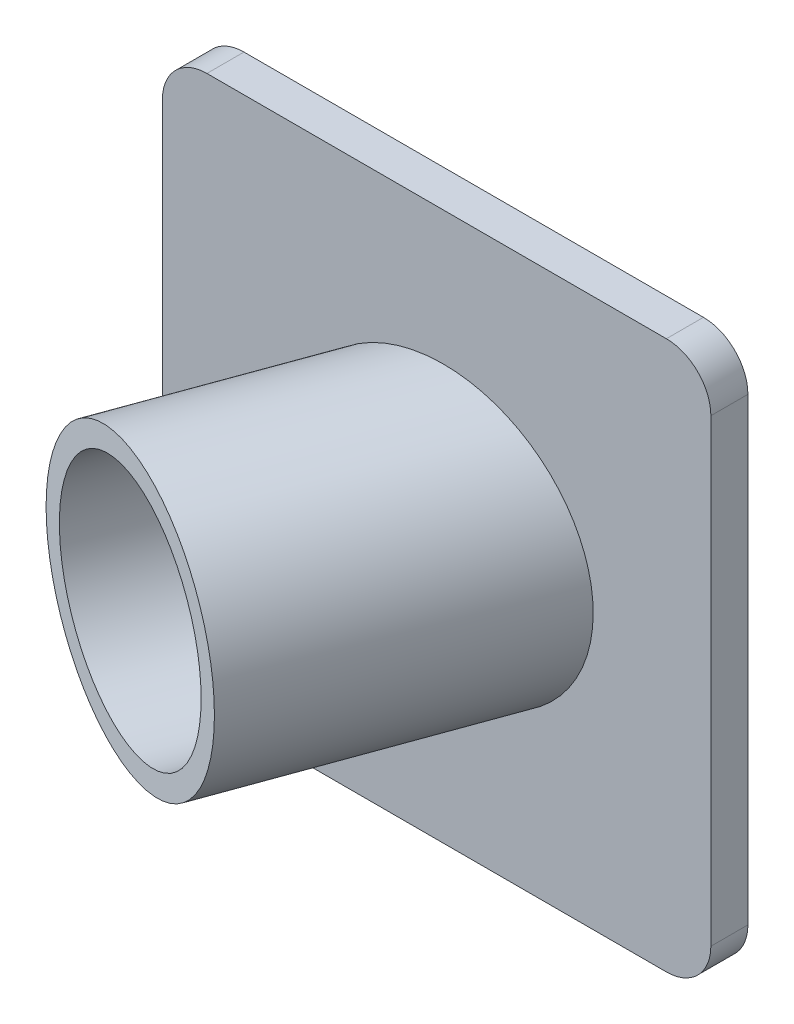
ISO-10303-21;
HEADER;
FILE_DESCRIPTION(('STEP AP214'),'2;1');
FILE_NAME('part.step','',(''),(''),'','','');
FILE_SCHEMA(('AUTOMOTIVE_DESIGN { 1 0 10303 214 1 1 1 1 }'));
ENDSEC;
DATA;
#1=APPLICATION_CONTEXT('core data for automotive mechanical design processes');
#2=APPLICATION_PROTOCOL_DEFINITION('international standard','automotive_design',2000,#1);
#3=PRODUCT_CONTEXT('',#1,'mechanical');
#4=PRODUCT('Part','Part','',(#3));
#5=PRODUCT_RELATED_PRODUCT_CATEGORY('part','',(#4));
#6=PRODUCT_DEFINITION_FORMATION('','',#4);
#7=PRODUCT_DEFINITION_CONTEXT('part definition',#1,'design');
#8=PRODUCT_DEFINITION('design','',#6,#7);
#9=PRODUCT_DEFINITION_SHAPE('','',#8);
#10=(LENGTH_UNIT() NAMED_UNIT(*) SI_UNIT(.MILLI.,.METRE.));
#11=(NAMED_UNIT(*) PLANE_ANGLE_UNIT() SI_UNIT($,.RADIAN.));
#12=(NAMED_UNIT(*) SI_UNIT($,.STERADIAN.) SOLID_ANGLE_UNIT());
#13=UNCERTAINTY_MEASURE_WITH_UNIT(LENGTH_MEASURE(1.E-05),#10,'distance_accuracy_value','');
#14=(GEOMETRIC_REPRESENTATION_CONTEXT(3) GLOBAL_UNCERTAINTY_ASSIGNED_CONTEXT((#13)) GLOBAL_UNIT_ASSIGNED_CONTEXT((#10,
#11,#12)) REPRESENTATION_CONTEXT('',''));
#15=CARTESIAN_POINT('',(0.,0.,0.));
#16=DIRECTION('',(0.,0.,1.));
#17=DIRECTION('',(1.,0.,0.));
#18=AXIS2_PLACEMENT_3D('',#15,#16,#17);
#19=CARTESIAN_POINT('',(-15.5,15.5,2.5));
#20=DIRECTION('',(0.,0.,-1.));
#21=DIRECTION('',(-1.,0.,0.));
#22=AXIS2_PLACEMENT_3D('',#19,#20,#21);
#23=CYLINDRICAL_SURFACE('',#22,3.);
#24=CARTESIAN_POINT('',(-15.5,15.5,0.));
#25=DIRECTION('',(0.,0.,1.));
#26=DIRECTION('',(-1.,0.,0.));
#27=AXIS2_PLACEMENT_3D('',#24,#25,#26);
#28=CIRCLE('',#27,3.);
#29=CARTESIAN_POINT('',(-15.5,18.5,0.));
#30=VERTEX_POINT('',#29);
#31=CARTESIAN_POINT('',(-18.5,15.5,0.));
#32=VERTEX_POINT('',#31);
#33=EDGE_CURVE('E135',#30,#32,#28,.T.);
#34=ORIENTED_EDGE('',*,*,#33,.T.);
#35=DIRECTION('',(0.,0.,-1.));
#36=VECTOR('',#35,1.);
#37=CARTESIAN_POINT('',(-18.5,15.5,2.5));
#38=LINE('',#37,#36);
#39=CARTESIAN_POINT('',(-18.5,15.5,2.5));
#40=VERTEX_POINT('',#39);
#41=EDGE_CURVE('E40',#40,#32,#38,.T.);
#42=ORIENTED_EDGE('',*,*,#41,.F.);
#43=CARTESIAN_POINT('',(-15.5,15.5,2.5));
#44=DIRECTION('',(0.,0.,1.));
#45=DIRECTION('',(-1.,0.,0.));
#46=AXIS2_PLACEMENT_3D('',#43,#44,#45);
#47=CIRCLE('',#46,3.);
#48=CARTESIAN_POINT('',(-15.5,18.5,2.5));
#49=VERTEX_POINT('',#48);
#50=EDGE_CURVE('E150',#49,#40,#47,.T.);
#51=ORIENTED_EDGE('',*,*,#50,.F.);
#52=DIRECTION('',(0.,0.,-1.));
#53=VECTOR('',#52,1.);
#54=CARTESIAN_POINT('',(-15.5,18.5,2.5));
#55=LINE('',#54,#53);
#56=EDGE_CURVE('E131',#49,#30,#55,.T.);
#57=ORIENTED_EDGE('',*,*,#56,.T.);
#58=EDGE_LOOP('',(#34,#42,#51,#57));
#59=FACE_BOUND('',#58,.T.);
#60=ADVANCED_FACE('F37',(#59),#23,.T.);
#61=CARTESIAN_POINT('',(-18.5,-15.5,2.5));
#62=DIRECTION('',(1.,0.,0.));
#63=DIRECTION('',(0.,1.,0.));
#64=AXIS2_PLACEMENT_3D('',#61,#62,#63);
#65=PLANE('',#64);
#66=DIRECTION('',(0.,-1.,0.));
#67=VECTOR('',#66,1.);
#68=CARTESIAN_POINT('',(-18.5,-15.5,0.));
#69=LINE('',#68,#67);
#70=CARTESIAN_POINT('',(-18.5,-15.5,0.));
#71=VERTEX_POINT('',#70);
#72=EDGE_CURVE('E138',#32,#71,#69,.T.);
#73=ORIENTED_EDGE('',*,*,#72,.T.);
#74=DIRECTION('',(0.,0.,-1.));
#75=VECTOR('',#74,1.);
#76=CARTESIAN_POINT('',(-18.5,-15.5,2.5));
#77=LINE('',#76,#75);
#78=CARTESIAN_POINT('',(-18.5,-15.5,2.5));
#79=VERTEX_POINT('',#78);
#80=EDGE_CURVE('E159',#79,#71,#77,.T.);
#81=ORIENTED_EDGE('',*,*,#80,.F.);
#82=DIRECTION('',(0.,-1.,0.));
#83=VECTOR('',#82,1.);
#84=CARTESIAN_POINT('',(-18.5,-15.5,2.5));
#85=LINE('',#84,#83);
#86=EDGE_CURVE('E98',#40,#79,#85,.T.);
#87=ORIENTED_EDGE('',*,*,#86,.F.);
#88=ORIENTED_EDGE('',*,*,#41,.T.);
#89=EDGE_LOOP('',(#73,#81,#87,#88));
#90=FACE_BOUND('',#89,.T.);
#91=ADVANCED_FACE('F165',(#90),#65,.F.);
#92=CARTESIAN_POINT('',(-15.5,-15.5,2.5));
#93=DIRECTION('',(0.,0.,-1.));
#94=DIRECTION('',(-1.,0.,0.));
#95=AXIS2_PLACEMENT_3D('',#92,#93,#94);
#96=CYLINDRICAL_SURFACE('',#95,3.);
#97=CARTESIAN_POINT('',(-15.5,-15.5,0.));
#98=DIRECTION('',(0.,0.,1.));
#99=DIRECTION('',(-1.,0.,0.));
#100=AXIS2_PLACEMENT_3D('',#97,#98,#99);
#101=CIRCLE('',#100,3.);
#102=CARTESIAN_POINT('',(-15.5,-18.5,0.));
#103=VERTEX_POINT('',#102);
#104=EDGE_CURVE('E141',#71,#103,#101,.T.);
#105=ORIENTED_EDGE('',*,*,#104,.T.);
#106=DIRECTION('',(0.,0.,-1.));
#107=VECTOR('',#106,1.);
#108=CARTESIAN_POINT('',(-15.5,-18.5,2.5));
#109=LINE('',#108,#107);
#110=CARTESIAN_POINT('',(-15.5,-18.5,2.5));
#111=VERTEX_POINT('',#110);
#112=EDGE_CURVE('E157',#111,#103,#109,.T.);
#113=ORIENTED_EDGE('',*,*,#112,.F.);
#114=CARTESIAN_POINT('',(-15.5,-15.5,2.5));
#115=DIRECTION('',(0.,0.,1.));
#116=DIRECTION('',(-1.,0.,0.));
#117=AXIS2_PLACEMENT_3D('',#114,#115,#116);
#118=CIRCLE('',#117,3.);
#119=EDGE_CURVE('E180',#79,#111,#118,.T.);
#120=ORIENTED_EDGE('',*,*,#119,.F.);
#121=ORIENTED_EDGE('',*,*,#80,.T.);
#122=EDGE_LOOP('',(#105,#113,#120,#121));
#123=FACE_BOUND('',#122,.T.);
#124=ADVANCED_FACE('F174',(#123),#96,.T.);
#125=CARTESIAN_POINT('',(-15.5,-18.5,2.5));
#126=DIRECTION('',(0.,1.,0.));
#127=DIRECTION('',(0.,0.,1.));
#128=AXIS2_PLACEMENT_3D('',#125,#126,#127);
#129=PLANE('',#128);
#130=DIRECTION('',(1.,0.,0.));
#131=VECTOR('',#130,1.);
#132=CARTESIAN_POINT('',(-15.5,-18.5,0.));
#133=LINE('',#132,#131);
#134=CARTESIAN_POINT('',(15.5,-18.5,0.));
#135=VERTEX_POINT('',#134);
#136=EDGE_CURVE('E143',#103,#135,#133,.T.);
#137=ORIENTED_EDGE('',*,*,#136,.T.);
#138=DIRECTION('',(0.,0.,-1.));
#139=VECTOR('',#138,1.);
#140=CARTESIAN_POINT('',(15.5,-18.5,2.5));
#141=LINE('',#140,#139);
#142=CARTESIAN_POINT('',(15.5,-18.5,2.5));
#143=VERTEX_POINT('',#142);
#144=EDGE_CURVE('E154',#143,#135,#141,.T.);
#145=ORIENTED_EDGE('',*,*,#144,.F.);
#146=DIRECTION('',(1.,0.,0.));
#147=VECTOR('',#146,1.);
#148=CARTESIAN_POINT('',(-15.5,-18.5,2.5));
#149=LINE('',#148,#147);
#150=EDGE_CURVE('E179',#111,#143,#149,.T.);
#151=ORIENTED_EDGE('',*,*,#150,.F.);
#152=ORIENTED_EDGE('',*,*,#112,.T.);
#153=EDGE_LOOP('',(#137,#145,#151,#152));
#154=FACE_BOUND('',#153,.T.);
#155=ADVANCED_FACE('F177',(#154),#129,.F.);
#156=CARTESIAN_POINT('',(15.5,-15.5,2.5));
#157=DIRECTION('',(0.,0.,-1.));
#158=DIRECTION('',(-1.,0.,0.));
#159=AXIS2_PLACEMENT_3D('',#156,#157,#158);
#160=CYLINDRICAL_SURFACE('',#159,3.);
#161=CARTESIAN_POINT('',(15.5,-15.5,0.));
#162=DIRECTION('',(0.,0.,1.));
#163=DIRECTION('',(1.,0.,0.));
#164=AXIS2_PLACEMENT_3D('',#161,#162,#163);
#165=CIRCLE('',#164,3.);
#166=CARTESIAN_POINT('',(18.5,-15.5,0.));
#167=VERTEX_POINT('',#166);
#168=EDGE_CURVE('E145',#135,#167,#165,.T.);
#169=ORIENTED_EDGE('',*,*,#168,.T.);
#170=DIRECTION('',(0.,0.,-1.));
#171=VECTOR('',#170,1.);
#172=CARTESIAN_POINT('',(18.5,-15.5,2.5));
#173=LINE('',#172,#171);
#174=CARTESIAN_POINT('',(18.5,-15.5,2.5));
#175=VERTEX_POINT('',#174);
#176=EDGE_CURVE('E126',#175,#167,#173,.T.);
#177=ORIENTED_EDGE('',*,*,#176,.F.);
#178=CARTESIAN_POINT('',(15.5,-15.5,2.5));
#179=DIRECTION('',(0.,0.,1.));
#180=DIRECTION('',(1.,0.,0.));
#181=AXIS2_PLACEMENT_3D('',#178,#179,#180);
#182=CIRCLE('',#181,3.);
#183=EDGE_CURVE('E117',#143,#175,#182,.T.);
#184=ORIENTED_EDGE('',*,*,#183,.F.);
#185=ORIENTED_EDGE('',*,*,#144,.T.);
#186=EDGE_LOOP('',(#169,#177,#184,#185));
#187=FACE_BOUND('',#186,.T.);
#188=ADVANCED_FACE('F225',(#187),#160,.T.);
#189=CARTESIAN_POINT('',(18.5,-15.5,2.5));
#190=DIRECTION('',(-1.,0.,0.));
#191=DIRECTION('',(0.,0.,1.));
#192=AXIS2_PLACEMENT_3D('',#189,#190,#191);
#193=PLANE('',#192);
#194=DIRECTION('',(0.,1.,0.));
#195=VECTOR('',#194,1.);
#196=CARTESIAN_POINT('',(18.5,-15.5,0.));
#197=LINE('',#196,#195);
#198=CARTESIAN_POINT('',(18.5,15.5,0.));
#199=VERTEX_POINT('',#198);
#200=EDGE_CURVE('E125',#167,#199,#197,.T.);
#201=ORIENTED_EDGE('',*,*,#200,.T.);
#202=DIRECTION('',(0.,0.,-1.));
#203=VECTOR('',#202,1.);
#204=CARTESIAN_POINT('',(18.5,15.5,2.5));
#205=LINE('',#204,#203);
#206=CARTESIAN_POINT('',(18.5,15.5,2.5));
#207=VERTEX_POINT('',#206);
#208=EDGE_CURVE('E122',#207,#199,#205,.T.);
#209=ORIENTED_EDGE('',*,*,#208,.F.);
#210=DIRECTION('',(0.,1.,0.));
#211=VECTOR('',#210,1.);
#212=CARTESIAN_POINT('',(18.5,-15.5,2.5));
#213=LINE('',#212,#211);
#214=EDGE_CURVE('E111',#175,#207,#213,.T.);
#215=ORIENTED_EDGE('',*,*,#214,.F.);
#216=ORIENTED_EDGE('',*,*,#176,.T.);
#217=EDGE_LOOP('',(#201,#209,#215,#216));
#218=FACE_BOUND('',#217,.T.);
#219=ADVANCED_FACE('F123',(#218),#193,.F.);
#220=CARTESIAN_POINT('',(15.5,15.5,2.5));
#221=DIRECTION('',(0.,0.,-1.));
#222=DIRECTION('',(-1.,0.,0.));
#223=AXIS2_PLACEMENT_3D('',#220,#221,#222);
#224=CYLINDRICAL_SURFACE('',#223,3.);
#225=CARTESIAN_POINT('',(15.5,15.5,0.));
#226=DIRECTION('',(0.,0.,1.));
#227=DIRECTION('',(1.,0.,0.));
#228=AXIS2_PLACEMENT_3D('',#225,#226,#227);
#229=CIRCLE('',#228,3.);
#230=CARTESIAN_POINT('',(15.5,18.5,0.));
#231=VERTEX_POINT('',#230);
#232=EDGE_CURVE('E83',#199,#231,#229,.T.);
#233=ORIENTED_EDGE('',*,*,#232,.T.);
#234=DIRECTION('',(0.,0.,-1.));
#235=VECTOR('',#234,1.);
#236=CARTESIAN_POINT('',(15.5,18.5,2.5));
#237=LINE('',#236,#235);
#238=CARTESIAN_POINT('',(15.5,18.5,2.5));
#239=VERTEX_POINT('',#238);
#240=EDGE_CURVE('E127',#239,#231,#237,.T.);
#241=ORIENTED_EDGE('',*,*,#240,.F.);
#242=CARTESIAN_POINT('',(15.5,15.5,2.5));
#243=DIRECTION('',(0.,0.,1.));
#244=DIRECTION('',(1.,0.,0.));
#245=AXIS2_PLACEMENT_3D('',#242,#243,#244);
#246=CIRCLE('',#245,3.);
#247=EDGE_CURVE('E115',#207,#239,#246,.T.);
#248=ORIENTED_EDGE('',*,*,#247,.F.);
#249=ORIENTED_EDGE('',*,*,#208,.T.);
#250=EDGE_LOOP('',(#233,#241,#248,#249));
#251=FACE_BOUND('',#250,.T.);
#252=ADVANCED_FACE('F129',(#251),#224,.T.);
#253=CARTESIAN_POINT('',(-15.5,18.5,2.5));
#254=DIRECTION('',(0.,-1.,0.));
#255=DIRECTION('',(1.,0.,0.));
#256=AXIS2_PLACEMENT_3D('',#253,#254,#255);
#257=PLANE('',#256);
#258=DIRECTION('',(-1.,0.,0.));
#259=VECTOR('',#258,1.);
#260=CARTESIAN_POINT('',(-15.5,18.5,0.));
#261=LINE('',#260,#259);
#262=EDGE_CURVE('E89',#231,#30,#261,.T.);
#263=ORIENTED_EDGE('',*,*,#262,.T.);
#264=ORIENTED_EDGE('',*,*,#56,.F.);
#265=DIRECTION('',(-1.,0.,0.));
#266=VECTOR('',#265,1.);
#267=CARTESIAN_POINT('',(-15.5,18.5,2.5));
#268=LINE('',#267,#266);
#269=EDGE_CURVE('E54',#239,#49,#268,.T.);
#270=ORIENTED_EDGE('',*,*,#269,.F.);
#271=ORIENTED_EDGE('',*,*,#240,.T.);
#272=EDGE_LOOP('',(#263,#264,#270,#271));
#273=FACE_BOUND('',#272,.T.);
#274=ADVANCED_FACE('F233',(#273),#257,.F.);
#275=CARTESIAN_POINT('',(-15.5,15.5,2.5));
#276=DIRECTION('',(0.,0.,-1.));
#277=DIRECTION('',(-1.,0.,0.));
#278=AXIS2_PLACEMENT_3D('',#275,#276,#277);
#279=PLANE('',#278);
#280=CARTESIAN_POINT('',(0.45259373950114,0.,2.5));
#281=DIRECTION('',(0.,0.,-1.));
#282=DIRECTION('',(-1.,0.,0.));
#283=AXIS2_PLACEMENT_3D('',#280,#281,#282);
#284=ELLIPSE('',#283,10.1096888385212,9.5);
#285=CARTESIAN_POINT('',(-9.65709509902003,0.,2.5));
#286=VERTEX_POINT('',#285);
#287=EDGE_CURVE('E11',#286,#286,#284,.F.);
#288=ORIENTED_EDGE('',*,*,#287,.F.);
#289=EDGE_LOOP('',(#288));
#290=FACE_BOUND('',#289,.T.);
#291=ORIENTED_EDGE('',*,*,#50,.T.);
#292=ORIENTED_EDGE('',*,*,#86,.T.);
#293=ORIENTED_EDGE('',*,*,#119,.T.);
#294=ORIENTED_EDGE('',*,*,#150,.T.);
#295=ORIENTED_EDGE('',*,*,#183,.T.);
#296=ORIENTED_EDGE('',*,*,#214,.T.);
#297=ORIENTED_EDGE('',*,*,#247,.T.);
#298=ORIENTED_EDGE('',*,*,#269,.T.);
#299=EDGE_LOOP('',(#291,#292,#293,#294,#295,#296,#297,#298));
#300=FACE_BOUND('',#299,.T.);
#301=ADVANCED_FACE('F113',(#290,#300),#279,.F.);
#302=CARTESIAN_POINT('',(-15.5,15.5,0.));
#303=DIRECTION('',(0.,0.,-1.));
#304=DIRECTION('',(-1.,0.,0.));
#305=AXIS2_PLACEMENT_3D('',#302,#303,#304);
#306=PLANE('',#305);
#307=ORIENTED_EDGE('',*,*,#33,.F.);
#308=ORIENTED_EDGE('',*,*,#262,.F.);
#309=ORIENTED_EDGE('',*,*,#232,.F.);
#310=ORIENTED_EDGE('',*,*,#200,.F.);
#311=ORIENTED_EDGE('',*,*,#168,.F.);
#312=ORIENTED_EDGE('',*,*,#136,.F.);
#313=ORIENTED_EDGE('',*,*,#104,.F.);
#314=ORIENTED_EDGE('',*,*,#72,.F.);
#315=EDGE_LOOP('',(#307,#308,#309,#310,#311,#312,#313,#314));
#316=FACE_BOUND('',#315,.T.);
#317=ADVANCED_FACE('F170',(#316),#306,.T.);
#318=CARTESIAN_POINT('',(9.93759482500676,0.,-23.5598263059292));
#319=DIRECTION('',(-0.342020143325669,0.,0.939692620785908));
#320=DIRECTION('',(0.939692620785908,0.,0.342020143325669));
#321=AXIS2_PLACEMENT_3D('',#318,#319,#320);
#322=CYLINDRICAL_SURFACE('',#321,9.5);
#323=ORIENTED_EDGE('',*,*,#287,.T.);
#324=EDGE_LOOP('',(#323));
#325=FACE_BOUND('',#324,.T.);
#326=CARTESIAN_POINT('',(-5.18464000508794,0.,17.9881724214461));
#327=DIRECTION('',(-0.342020143325669,0.,0.939692620785908));
#328=DIRECTION('',(0.939692620785908,0.,0.342020143325669));
#329=AXIS2_PLACEMENT_3D('',#326,#327,#328);
#330=CIRCLE('',#329,9.5);
#331=CARTESIAN_POINT('',(3.74243989237818,0.,21.23736378304));
#332=VERTEX_POINT('',#331);
#333=EDGE_CURVE('E139',#332,#332,#330,.T.);
#334=ORIENTED_EDGE('',*,*,#333,.F.);
#335=EDGE_LOOP('',(#334));
#336=FACE_BOUND('',#335,.T.);
#337=ADVANCED_FACE('F202',(#325,#336),#322,.T.);
#338=CARTESIAN_POINT('',(-5.18464000508794,0.,17.9881724214461));
#339=DIRECTION('',(-0.342020143325669,0.,0.939692620785908));
#340=DIRECTION('',(0.939692620785908,0.,0.342020143325669));
#341=AXIS2_PLACEMENT_3D('',#338,#339,#340);
#342=PLANE('',#341);
#343=CARTESIAN_POINT('',(-5.18464000508794,0.,17.9881724214461));
#344=DIRECTION('',(-0.342020143325669,0.,0.939692620785908));
#345=DIRECTION('',(0.939692620785908,0.,0.342020143325669));
#346=AXIS2_PLACEMENT_3D('',#343,#344,#345);
#347=CIRCLE('',#346,8.);
#348=CARTESIAN_POINT('',(2.33290096119932,0.,20.7243335680515));
#349=VERTEX_POINT('',#348);
#350=EDGE_CURVE('E191',#349,#349,#347,.T.);
#351=ORIENTED_EDGE('',*,*,#350,.F.);
#352=EDGE_LOOP('',(#351));
#353=FACE_BOUND('',#352,.T.);
#354=ORIENTED_EDGE('',*,*,#333,.T.);
#355=EDGE_LOOP('',(#354));
#356=FACE_BOUND('',#355,.T.);
#357=ADVANCED_FACE('F198',(#353,#356),#342,.T.);
#358=CARTESIAN_POINT('',(-15.5,15.5,2.5));
#359=DIRECTION('',(0.,0.,-1.));
#360=DIRECTION('',(-1.,0.,0.));
#361=AXIS2_PLACEMENT_3D('',#358,#359,#360);
#362=PLANE('',#361);
#363=CARTESIAN_POINT('',(0.452593739501132,0.,2.5));
#364=DIRECTION('',(0.,0.,-1.));
#365=DIRECTION('',(-1.,0.,0.));
#366=AXIS2_PLACEMENT_3D('',#363,#364,#365);
#367=ELLIPSE('',#366,8.5134221798073,8.);
#368=CARTESIAN_POINT('',(-8.06082844030617,0.,2.5));
#369=VERTEX_POINT('',#368);
#370=EDGE_CURVE('E188',#369,#369,#367,.F.);
#371=ORIENTED_EDGE('',*,*,#370,.T.);
#372=EDGE_LOOP('',(#371));
#373=FACE_BOUND('',#372,.T.);
#374=ADVANCED_FACE('F201',(#373),#362,.F.);
#375=CARTESIAN_POINT('',(8.43996307466375,0.,-19.4451168892036));
#376=DIRECTION('',(-0.342020143325669,0.,0.939692620785908));
#377=DIRECTION('',(0.939692620785908,0.,0.342020143325669));
#378=AXIS2_PLACEMENT_3D('',#375,#376,#377);
#379=CYLINDRICAL_SURFACE('',#378,8.);
#380=ORIENTED_EDGE('',*,*,#350,.T.);
#381=EDGE_LOOP('',(#380));
#382=FACE_BOUND('',#381,.T.);
#383=ORIENTED_EDGE('',*,*,#370,.F.);
#384=EDGE_LOOP('',(#383));
#385=FACE_BOUND('',#384,.T.);
#386=ADVANCED_FACE('F195',(#382,#385),#379,.F.);
#387=CLOSED_SHELL('',(#60,#91,#124,#155,#188,#219,#252,#274,#301,#317,#337,#357,#374,#386));
#388=MANIFOLD_SOLID_BREP('B2',#387);
#389=ADVANCED_BREP_SHAPE_REPRESENTATION('',(#18,#388),#14);
#390=SHAPE_DEFINITION_REPRESENTATION(#9,#389);
ENDSEC;
END-ISO-10303-21;
